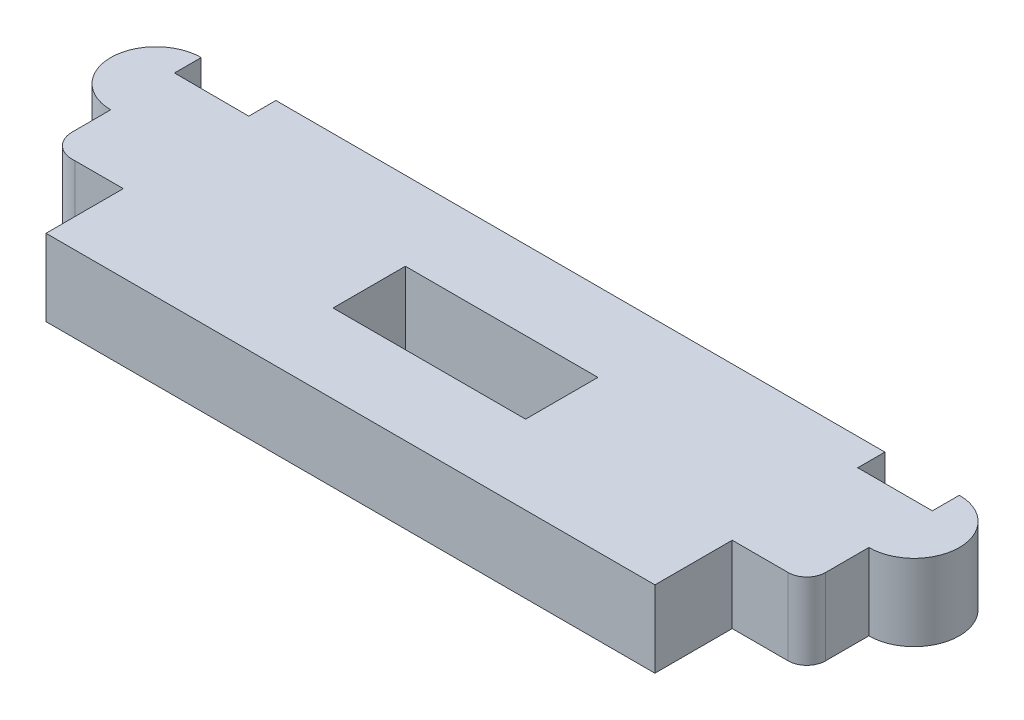
ISO-10303-21;
HEADER;
FILE_DESCRIPTION(('STEP AP214'),'2;1');
FILE_NAME('part.step','',(''),(''),'','','');
FILE_SCHEMA(('AUTOMOTIVE_DESIGN { 1 0 10303 214 1 1 1 1 }'));
ENDSEC;
DATA;
#1=APPLICATION_CONTEXT('core data for automotive mechanical design processes');
#2=APPLICATION_PROTOCOL_DEFINITION('international standard','automotive_design',2000,#1);
#3=PRODUCT_CONTEXT('',#1,'mechanical');
#4=PRODUCT('Part','Part','',(#3));
#5=PRODUCT_RELATED_PRODUCT_CATEGORY('part','',(#4));
#6=PRODUCT_DEFINITION_FORMATION('','',#4);
#7=PRODUCT_DEFINITION_CONTEXT('part definition',#1,'design');
#8=PRODUCT_DEFINITION('design','',#6,#7);
#9=PRODUCT_DEFINITION_SHAPE('','',#8);
#10=(LENGTH_UNIT() NAMED_UNIT(*) SI_UNIT(.MILLI.,.METRE.));
#11=(NAMED_UNIT(*) PLANE_ANGLE_UNIT() SI_UNIT($,.RADIAN.));
#12=(NAMED_UNIT(*) SI_UNIT($,.STERADIAN.) SOLID_ANGLE_UNIT());
#13=UNCERTAINTY_MEASURE_WITH_UNIT(LENGTH_MEASURE(1.E-05),#10,'distance_accuracy_value','');
#14=(GEOMETRIC_REPRESENTATION_CONTEXT(3) GLOBAL_UNCERTAINTY_ASSIGNED_CONTEXT((#13)) GLOBAL_UNIT_ASSIGNED_CONTEXT((#10,
#11,#12)) REPRESENTATION_CONTEXT('',''));
#15=CARTESIAN_POINT('',(0.,0.,0.));
#16=DIRECTION('',(0.,0.,1.));
#17=DIRECTION('',(1.,0.,0.));
#18=AXIS2_PLACEMENT_3D('',#15,#16,#17);
#19=CARTESIAN_POINT('',(-14.7404739766212,3.175,0.76986769505058));
#20=DIRECTION('',(0.,1.,0.));
#21=DIRECTION('',(0.,0.,1.));
#22=AXIS2_PLACEMENT_3D('',#19,#20,#21);
#23=PLANE('',#22);
#24=DIRECTION('',(1.,0.,0.));
#25=VECTOR('',#24,1.);
#26=CARTESIAN_POINT('',(14.9316149708302,3.175,1.7445249441059));
#27=LINE('',#26,#25);
#28=CARTESIAN_POINT('',(12.6259984908906,3.175,1.7445249441059));
#29=VERTEX_POINT('',#28);
#30=CARTESIAN_POINT('',(14.9316149708302,3.175,1.7445249441059));
#31=VERTEX_POINT('',#30);
#32=EDGE_CURVE('E218',#29,#31,#27,.T.);
#33=ORIENTED_EDGE('',*,*,#32,.T.);
#34=CARTESIAN_POINT('',(14.9485151949497,3.175,0.972713754794907));
#35=DIRECTION('',(0.,1.,0.));
#36=DIRECTION('',(0.,0.,-1.));
#37=AXIS2_PLACEMENT_3D('',#34,#35,#36);
#38=CIRCLE('',#37,0.771996197866893);
#39=CARTESIAN_POINT('',(15.7205113928165,3.175,0.972713754794907));
#40=VERTEX_POINT('',#39);
#41=EDGE_CURVE('E221',#31,#40,#38,.T.);
#42=ORIENTED_EDGE('',*,*,#41,.T.);
#43=DIRECTION('',(0.,0.,-1.));
#44=VECTOR('',#43,1.);
#45=CARTESIAN_POINT('',(15.7205113928165,3.175,-0.826531771009664));
#46=LINE('',#45,#44);
#47=CARTESIAN_POINT('',(15.7205113928165,3.175,-0.826531771009664));
#48=VERTEX_POINT('',#47);
#49=EDGE_CURVE('E224',#40,#48,#46,.T.);
#50=ORIENTED_EDGE('',*,*,#49,.T.);
#51=CARTESIAN_POINT('',(15.7205113928165,3.175,-2.70387840124867));
#52=DIRECTION('',(0.,1.,0.));
#53=DIRECTION('',(0.,0.,1.));
#54=AXIS2_PLACEMENT_3D('',#51,#52,#53);
#55=CIRCLE('',#54,1.877346630239);
#56=CARTESIAN_POINT('',(15.7205113928165,3.175,-4.58122503148767));
#57=VERTEX_POINT('',#56);
#58=EDGE_CURVE('E226',#48,#57,#55,.T.);
#59=ORIENTED_EDGE('',*,*,#58,.T.);
#60=DIRECTION('',(0.,0.,1.));
#61=VECTOR('',#60,1.);
#62=CARTESIAN_POINT('',(15.7205113928165,3.175,-3.46087411286336));
#63=LINE('',#62,#61);
#64=CARTESIAN_POINT('',(15.7205113928165,3.175,-3.46087411286336));
#65=VERTEX_POINT('',#64);
#66=EDGE_CURVE('E228',#57,#65,#63,.T.);
#67=ORIENTED_EDGE('',*,*,#66,.T.);
#68=DIRECTION('',(-1.,0.,0.));
#69=VECTOR('',#68,1.);
#70=CARTESIAN_POINT('',(12.6259984909252,3.175,-3.46087411286336));
#71=LINE('',#70,#69);
#72=CARTESIAN_POINT('',(12.6259984909252,3.175,-3.46087411286336));
#73=VERTEX_POINT('',#72);
#74=EDGE_CURVE('E230',#65,#73,#71,.T.);
#75=ORIENTED_EDGE('',*,*,#74,.T.);
#76=DIRECTION('',(0.,0.,-1.));
#77=VECTOR('',#76,1.);
#78=CARTESIAN_POINT('',(12.6259984909252,3.175,-4.58696761607907));
#79=LINE('',#78,#77);
#80=CARTESIAN_POINT('',(12.6259984909252,3.175,-4.58696761607907));
#81=VERTEX_POINT('',#80);
#82=EDGE_CURVE('E232',#73,#81,#79,.T.);
#83=ORIENTED_EDGE('',*,*,#82,.T.);
#84=DIRECTION('',(-1.,0.,0.));
#85=VECTOR('',#84,1.);
#86=CARTESIAN_POINT('',(-12.6312993131997,3.175,-4.58696761607907));
#87=LINE('',#86,#85);
#88=CARTESIAN_POINT('',(-12.6312993131997,3.175,-4.58696761607907));
#89=VERTEX_POINT('',#88);
#90=EDGE_CURVE('E234',#81,#89,#87,.T.);
#91=ORIENTED_EDGE('',*,*,#90,.T.);
#92=DIRECTION('',(0.,0.,1.));
#93=VECTOR('',#92,1.);
#94=CARTESIAN_POINT('',(-12.6312993131997,3.175,-3.46087411280918));
#95=LINE('',#94,#93);
#96=CARTESIAN_POINT('',(-12.6312993131997,3.175,-3.46087411280918));
#97=VERTEX_POINT('',#96);
#98=EDGE_CURVE('E236',#89,#97,#95,.T.);
#99=ORIENTED_EDGE('',*,*,#98,.T.);
#100=DIRECTION('',(-0.999993805106352,0.,-0.00351990751562791));
#101=VECTOR('',#100,1.);
#102=CARTESIAN_POINT('',(-15.7221735355993,3.175,-3.4717537716128));
#103=LINE('',#102,#101);
#104=CARTESIAN_POINT('',(-15.7221735355993,3.175,-3.4717537716128));
#105=VERTEX_POINT('',#104);
#106=EDGE_CURVE('E238',#97,#105,#103,.T.);
#107=ORIENTED_EDGE('',*,*,#106,.T.);
#108=DIRECTION('',(0.,0.,-1.));
#109=VECTOR('',#108,1.);
#110=CARTESIAN_POINT('',(-15.7221735355993,3.175,-4.5812250315731));
#111=LINE('',#110,#109);
#112=CARTESIAN_POINT('',(-15.7221735355993,3.175,-4.5812250315731));
#113=VERTEX_POINT('',#112);
#114=EDGE_CURVE('E240',#105,#113,#111,.T.);
#115=ORIENTED_EDGE('',*,*,#114,.T.);
#116=CARTESIAN_POINT('',(-15.7221735355993,3.175,-2.70403466214097));
#117=DIRECTION('',(0.,1.,0.));
#118=DIRECTION('',(0.,0.,1.));
#119=AXIS2_PLACEMENT_3D('',#116,#117,#118);
#120=CIRCLE('',#119,1.87719036943212);
#121=CARTESIAN_POINT('',(-15.7221735355993,3.175,-0.82684429270885));
#122=VERTEX_POINT('',#121);
#123=EDGE_CURVE('E242',#113,#122,#120,.T.);
#124=ORIENTED_EDGE('',*,*,#123,.T.);
#125=DIRECTION('',(0.,0.,1.));
#126=VECTOR('',#125,1.);
#127=CARTESIAN_POINT('',(-15.7221735355993,3.175,0.76986769505058));
#128=LINE('',#127,#126);
#129=CARTESIAN_POINT('',(-15.7221735355993,3.175,0.76986769505058));
#130=VERTEX_POINT('',#129);
#131=EDGE_CURVE('E244',#122,#130,#128,.T.);
#132=ORIENTED_EDGE('',*,*,#131,.T.);
#133=CARTESIAN_POINT('',(-14.7404739766212,3.175,0.76986769505058));
#134=DIRECTION('',(0.,1.,0.));
#135=DIRECTION('',(0.,0.,1.));
#136=AXIS2_PLACEMENT_3D('',#133,#134,#135);
#137=CIRCLE('',#136,0.981699558978084);
#138=CARTESIAN_POINT('',(-14.6230973564544,3.175,1.74452494410585));
#139=VERTEX_POINT('',#138);
#140=EDGE_CURVE('E246',#130,#139,#137,.T.);
#141=ORIENTED_EDGE('',*,*,#140,.T.);
#142=DIRECTION('',(1.,0.,0.));
#143=VECTOR('',#142,1.);
#144=CARTESIAN_POINT('',(-12.6291302410735,3.175,1.74452494410585));
#145=LINE('',#144,#143);
#146=CARTESIAN_POINT('',(-12.6291302410735,3.175,1.74452494410585));
#147=VERTEX_POINT('',#146);
#148=EDGE_CURVE('E248',#139,#147,#145,.T.);
#149=ORIENTED_EDGE('',*,*,#148,.T.);
#150=DIRECTION('',(0.,0.,1.));
#151=VECTOR('',#150,1.);
#152=CARTESIAN_POINT('',(-12.6291302410735,3.175,4.95039118635524));
#153=LINE('',#152,#151);
#154=CARTESIAN_POINT('',(-12.6291302410735,3.175,4.95039118635524));
#155=VERTEX_POINT('',#154);
#156=EDGE_CURVE('E250',#147,#155,#153,.T.);
#157=ORIENTED_EDGE('',*,*,#156,.T.);
#158=DIRECTION('',(1.,0.,0.));
#159=VECTOR('',#158,1.);
#160=CARTESIAN_POINT('',(12.6259984908906,3.175,4.95039118635524));
#161=LINE('',#160,#159);
#162=CARTESIAN_POINT('',(12.6259984908906,3.175,4.95039118635524));
#163=VERTEX_POINT('',#162);
#164=EDGE_CURVE('E252',#155,#163,#161,.T.);
#165=ORIENTED_EDGE('',*,*,#164,.T.);
#166=DIRECTION('',(0.,0.,-1.));
#167=VECTOR('',#166,1.);
#168=CARTESIAN_POINT('',(12.6259984908906,3.175,1.7445249441059));
#169=LINE('',#168,#167);
#170=EDGE_CURVE('E254',#163,#29,#169,.T.);
#171=ORIENTED_EDGE('',*,*,#170,.T.);
#172=EDGE_LOOP('',(#33,#42,#50,#59,#67,#75,#83,#91,#99,#107,#115,#124,#132,#141,#149,#157,#165,#171));
#173=FACE_BOUND('',#172,.T.);
#174=DIRECTION('',(0.,0.,1.));
#175=VECTOR('',#174,1.);
#176=CARTESIAN_POINT('',(-3.99291334830593,3.175,1.68174716550343));
#177=LINE('',#176,#175);
#178=CARTESIAN_POINT('',(-3.99291334830593,3.175,-1.31834312696205));
#179=VERTEX_POINT('',#178);
#180=CARTESIAN_POINT('',(-3.99291334830593,3.175,1.68174716550343));
#181=VERTEX_POINT('',#180);
#182=EDGE_CURVE('E190',#179,#181,#177,.T.);
#183=ORIENTED_EDGE('',*,*,#182,.F.);
#184=DIRECTION('',(-1.,0.,0.));
#185=VECTOR('',#184,1.);
#186=CARTESIAN_POINT('',(-3.99291334830593,3.175,-1.31834312696205));
#187=LINE('',#186,#185);
#188=CARTESIAN_POINT('',(3.99291822223341,3.175,-1.31834312696205));
#189=VERTEX_POINT('',#188);
#190=EDGE_CURVE('E182',#189,#179,#187,.T.);
#191=ORIENTED_EDGE('',*,*,#190,.F.);
#192=DIRECTION('',(0.,0.,-1.));
#193=VECTOR('',#192,1.);
#194=CARTESIAN_POINT('',(3.99291822223341,3.175,-1.31834312696205));
#195=LINE('',#194,#193);
#196=CARTESIAN_POINT('',(3.99291822223341,3.175,1.68174716550343));
#197=VERTEX_POINT('',#196);
#198=EDGE_CURVE('E204',#197,#189,#195,.T.);
#199=ORIENTED_EDGE('',*,*,#198,.F.);
#200=DIRECTION('',(1.,0.,0.));
#201=VECTOR('',#200,1.);
#202=CARTESIAN_POINT('',(3.99291822223341,3.175,1.68174716550343));
#203=LINE('',#202,#201);
#204=EDGE_CURVE('E202',#181,#197,#203,.T.);
#205=ORIENTED_EDGE('',*,*,#204,.F.);
#206=EDGE_LOOP('',(#183,#191,#199,#205));
#207=FACE_BOUND('',#206,.T.);
#208=ADVANCED_FACE('F33',(#173,#207),#23,.T.);
#209=CARTESIAN_POINT('',(-14.7404739766212,0.,0.76986769505058));
#210=DIRECTION('',(0.,1.,0.));
#211=DIRECTION('',(0.,0.,1.));
#212=AXIS2_PLACEMENT_3D('',#209,#210,#211);
#213=PLANE('',#212);
#214=DIRECTION('',(1.,0.,0.));
#215=VECTOR('',#214,1.);
#216=CARTESIAN_POINT('',(14.9316149708302,0.,1.7445249441059));
#217=LINE('',#216,#215);
#218=CARTESIAN_POINT('',(12.6259984908906,0.,1.7445249441059));
#219=VERTEX_POINT('',#218);
#220=CARTESIAN_POINT('',(14.9316149708302,0.,1.7445249441059));
#221=VERTEX_POINT('',#220);
#222=EDGE_CURVE('E198',#219,#221,#217,.T.);
#223=ORIENTED_EDGE('',*,*,#222,.F.);
#224=DIRECTION('',(0.,0.,-1.));
#225=VECTOR('',#224,1.);
#226=CARTESIAN_POINT('',(12.6259984908906,0.,1.7445249441059));
#227=LINE('',#226,#225);
#228=CARTESIAN_POINT('',(12.6259984908906,0.,4.95039118635524));
#229=VERTEX_POINT('',#228);
#230=EDGE_CURVE('E222',#229,#219,#227,.T.);
#231=ORIENTED_EDGE('',*,*,#230,.F.);
#232=DIRECTION('',(1.,0.,0.));
#233=VECTOR('',#232,1.);
#234=CARTESIAN_POINT('',(12.6259984908906,0.,4.95039118635524));
#235=LINE('',#234,#233);
#236=CARTESIAN_POINT('',(-12.6291302410735,0.,4.95039118635524));
#237=VERTEX_POINT('',#236);
#238=EDGE_CURVE('E289',#237,#229,#235,.T.);
#239=ORIENTED_EDGE('',*,*,#238,.F.);
#240=DIRECTION('',(0.,0.,1.));
#241=VECTOR('',#240,1.);
#242=CARTESIAN_POINT('',(-12.6291302410735,0.,4.95039118635524));
#243=LINE('',#242,#241);
#244=CARTESIAN_POINT('',(-12.6291302410735,0.,1.74452494410585));
#245=VERTEX_POINT('',#244);
#246=EDGE_CURVE('E287',#245,#237,#243,.T.);
#247=ORIENTED_EDGE('',*,*,#246,.F.);
#248=DIRECTION('',(1.,0.,0.));
#249=VECTOR('',#248,1.);
#250=CARTESIAN_POINT('',(-12.6291302410735,0.,1.74452494410585));
#251=LINE('',#250,#249);
#252=CARTESIAN_POINT('',(-14.6230973564544,0.,1.74452494410585));
#253=VERTEX_POINT('',#252);
#254=EDGE_CURVE('E285',#253,#245,#251,.T.);
#255=ORIENTED_EDGE('',*,*,#254,.F.);
#256=CARTESIAN_POINT('',(-14.7404739766212,0.,0.76986769505058));
#257=DIRECTION('',(0.,1.,0.));
#258=DIRECTION('',(0.,0.,1.));
#259=AXIS2_PLACEMENT_3D('',#256,#257,#258);
#260=CIRCLE('',#259,0.981699558978084);
#261=CARTESIAN_POINT('',(-15.7221735355993,0.,0.76986769505058));
#262=VERTEX_POINT('',#261);
#263=EDGE_CURVE('E283',#262,#253,#260,.T.);
#264=ORIENTED_EDGE('',*,*,#263,.F.);
#265=DIRECTION('',(0.,0.,1.));
#266=VECTOR('',#265,1.);
#267=CARTESIAN_POINT('',(-15.7221735355993,0.,0.76986769505058));
#268=LINE('',#267,#266);
#269=CARTESIAN_POINT('',(-15.7221735355993,0.,-0.82684429270885));
#270=VERTEX_POINT('',#269);
#271=EDGE_CURVE('E281',#270,#262,#268,.T.);
#272=ORIENTED_EDGE('',*,*,#271,.F.);
#273=CARTESIAN_POINT('',(-15.7221735355993,0.,-2.70403466214097));
#274=DIRECTION('',(0.,1.,0.));
#275=DIRECTION('',(0.,0.,1.));
#276=AXIS2_PLACEMENT_3D('',#273,#274,#275);
#277=CIRCLE('',#276,1.87719036943212);
#278=CARTESIAN_POINT('',(-15.7221735355993,0.,-4.5812250315731));
#279=VERTEX_POINT('',#278);
#280=EDGE_CURVE('E279',#279,#270,#277,.T.);
#281=ORIENTED_EDGE('',*,*,#280,.F.);
#282=DIRECTION('',(0.,0.,-1.));
#283=VECTOR('',#282,1.);
#284=CARTESIAN_POINT('',(-15.7221735355993,0.,-4.5812250315731));
#285=LINE('',#284,#283);
#286=CARTESIAN_POINT('',(-15.7221735355993,0.,-3.4717537716128));
#287=VERTEX_POINT('',#286);
#288=EDGE_CURVE('E277',#287,#279,#285,.T.);
#289=ORIENTED_EDGE('',*,*,#288,.F.);
#290=DIRECTION('',(-0.999993805106352,0.,-0.00351990751562791));
#291=VECTOR('',#290,1.);
#292=CARTESIAN_POINT('',(-15.7221735355993,0.,-3.4717537716128));
#293=LINE('',#292,#291);
#294=CARTESIAN_POINT('',(-12.6312993131997,0.,-3.46087411280918));
#295=VERTEX_POINT('',#294);
#296=EDGE_CURVE('E275',#295,#287,#293,.T.);
#297=ORIENTED_EDGE('',*,*,#296,.F.);
#298=DIRECTION('',(0.,0.,1.));
#299=VECTOR('',#298,1.);
#300=CARTESIAN_POINT('',(-12.6312993131997,0.,-3.46087411280918));
#301=LINE('',#300,#299);
#302=CARTESIAN_POINT('',(-12.6312993131997,0.,-4.58696761607907));
#303=VERTEX_POINT('',#302);
#304=EDGE_CURVE('E273',#303,#295,#301,.T.);
#305=ORIENTED_EDGE('',*,*,#304,.F.);
#306=DIRECTION('',(-1.,0.,0.));
#307=VECTOR('',#306,1.);
#308=CARTESIAN_POINT('',(-12.6312993131997,0.,-4.58696761607907));
#309=LINE('',#308,#307);
#310=CARTESIAN_POINT('',(12.6259984909252,0.,-4.58696761607907));
#311=VERTEX_POINT('',#310);
#312=EDGE_CURVE('E271',#311,#303,#309,.T.);
#313=ORIENTED_EDGE('',*,*,#312,.F.);
#314=DIRECTION('',(0.,0.,-1.));
#315=VECTOR('',#314,1.);
#316=CARTESIAN_POINT('',(12.6259984909252,0.,-4.58696761607907));
#317=LINE('',#316,#315);
#318=CARTESIAN_POINT('',(12.6259984909252,0.,-3.46087411286336));
#319=VERTEX_POINT('',#318);
#320=EDGE_CURVE('E269',#319,#311,#317,.T.);
#321=ORIENTED_EDGE('',*,*,#320,.F.);
#322=DIRECTION('',(-1.,0.,0.));
#323=VECTOR('',#322,1.);
#324=CARTESIAN_POINT('',(12.6259984909252,0.,-3.46087411286336));
#325=LINE('',#324,#323);
#326=CARTESIAN_POINT('',(15.7205113928165,0.,-3.46087411286336));
#327=VERTEX_POINT('',#326);
#328=EDGE_CURVE('E267',#327,#319,#325,.T.);
#329=ORIENTED_EDGE('',*,*,#328,.F.);
#330=DIRECTION('',(0.,0.,1.));
#331=VECTOR('',#330,1.);
#332=CARTESIAN_POINT('',(15.7205113928165,0.,-3.46087411286336));
#333=LINE('',#332,#331);
#334=CARTESIAN_POINT('',(15.7205113928165,0.,-4.58122503148767));
#335=VERTEX_POINT('',#334);
#336=EDGE_CURVE('E265',#335,#327,#333,.T.);
#337=ORIENTED_EDGE('',*,*,#336,.F.);
#338=CARTESIAN_POINT('',(15.7205113928165,0.,-2.70387840124867));
#339=DIRECTION('',(0.,1.,0.));
#340=DIRECTION('',(0.,0.,1.));
#341=AXIS2_PLACEMENT_3D('',#338,#339,#340);
#342=CIRCLE('',#341,1.877346630239);
#343=CARTESIAN_POINT('',(15.7205113928165,0.,-0.826531771009664));
#344=VERTEX_POINT('',#343);
#345=EDGE_CURVE('E263',#344,#335,#342,.T.);
#346=ORIENTED_EDGE('',*,*,#345,.F.);
#347=DIRECTION('',(0.,0.,-1.));
#348=VECTOR('',#347,1.);
#349=CARTESIAN_POINT('',(15.7205113928165,0.,-0.826531771009664));
#350=LINE('',#349,#348);
#351=CARTESIAN_POINT('',(15.7205113928165,0.,0.972713754794907));
#352=VERTEX_POINT('',#351);
#353=EDGE_CURVE('E261',#352,#344,#350,.T.);
#354=ORIENTED_EDGE('',*,*,#353,.F.);
#355=CARTESIAN_POINT('',(14.9485151949497,0.,0.972713754794907));
#356=DIRECTION('',(0.,1.,0.));
#357=DIRECTION('',(0.,0.,-1.));
#358=AXIS2_PLACEMENT_3D('',#355,#356,#357);
#359=CIRCLE('',#358,0.771996197866893);
#360=EDGE_CURVE('E259',#221,#352,#359,.T.);
#361=ORIENTED_EDGE('',*,*,#360,.F.);
#362=EDGE_LOOP('',(#223,#231,#239,#247,#255,#264,#272,#281,#289,#297,#305,#313,#321,#329,#337,
#346,#354,#361));
#363=FACE_BOUND('',#362,.T.);
#364=DIRECTION('',(-1.,0.,0.));
#365=VECTOR('',#364,1.);
#366=CARTESIAN_POINT('',(-3.99291334830593,0.,-1.31834312696205));
#367=LINE('',#366,#365);
#368=CARTESIAN_POINT('',(3.99291822223341,0.,-1.31834312696205));
#369=VERTEX_POINT('',#368);
#370=CARTESIAN_POINT('',(-3.99291334830593,0.,-1.31834312696205));
#371=VERTEX_POINT('',#370);
#372=EDGE_CURVE('E56',#369,#371,#367,.T.);
#373=ORIENTED_EDGE('',*,*,#372,.T.);
#374=DIRECTION('',(0.,0.,1.));
#375=VECTOR('',#374,1.);
#376=CARTESIAN_POINT('',(-3.99291334830593,0.,1.68174716550343));
#377=LINE('',#376,#375);
#378=CARTESIAN_POINT('',(-3.99291334830593,0.,1.68174716550343));
#379=VERTEX_POINT('',#378);
#380=EDGE_CURVE('E197',#371,#379,#377,.T.);
#381=ORIENTED_EDGE('',*,*,#380,.T.);
#382=DIRECTION('',(1.,0.,0.));
#383=VECTOR('',#382,1.);
#384=CARTESIAN_POINT('',(3.99291822223341,0.,1.68174716550343));
#385=LINE('',#384,#383);
#386=CARTESIAN_POINT('',(3.99291822223341,0.,1.68174716550343));
#387=VERTEX_POINT('',#386);
#388=EDGE_CURVE('E210',#379,#387,#385,.T.);
#389=ORIENTED_EDGE('',*,*,#388,.T.);
#390=DIRECTION('',(0.,0.,-1.));
#391=VECTOR('',#390,1.);
#392=CARTESIAN_POINT('',(3.99291822223341,0.,-1.31834312696205));
#393=LINE('',#392,#391);
#394=EDGE_CURVE('E191',#387,#369,#393,.T.);
#395=ORIENTED_EDGE('',*,*,#394,.T.);
#396=EDGE_LOOP('',(#373,#381,#389,#395));
#397=FACE_BOUND('',#396,.T.);
#398=ADVANCED_FACE('F349',(#363,#397),#213,.F.);
#399=CARTESIAN_POINT('',(14.9316149708302,3.175,1.7445249441059));
#400=DIRECTION('',(0.,0.,-1.));
#401=DIRECTION('',(-1.,0.,0.));
#402=AXIS2_PLACEMENT_3D('',#399,#400,#401);
#403=PLANE('',#402);
#404=ORIENTED_EDGE('',*,*,#222,.T.);
#405=DIRECTION('',(0.,-1.,0.));
#406=VECTOR('',#405,1.);
#407=CARTESIAN_POINT('',(14.9316149708302,3.175,1.7445249441059));
#408=LINE('',#407,#406);
#409=EDGE_CURVE('E11',#31,#221,#408,.T.);
#410=ORIENTED_EDGE('',*,*,#409,.F.);
#411=ORIENTED_EDGE('',*,*,#32,.F.);
#412=DIRECTION('',(0.,-1.,0.));
#413=VECTOR('',#412,1.);
#414=CARTESIAN_POINT('',(12.6259984908906,3.175,1.7445249441059));
#415=LINE('',#414,#413);
#416=EDGE_CURVE('E256',#29,#219,#415,.T.);
#417=ORIENTED_EDGE('',*,*,#416,.T.);
#418=EDGE_LOOP('',(#404,#410,#411,#417));
#419=FACE_BOUND('',#418,.T.);
#420=ADVANCED_FACE('F35',(#419),#403,.F.);
#421=CARTESIAN_POINT('',(14.9485151949497,3.175,0.972713754794907));
#422=DIRECTION('',(0.,-1.,0.));
#423=DIRECTION('',(0.,0.,-1.));
#424=AXIS2_PLACEMENT_3D('',#421,#422,#423);
#425=CYLINDRICAL_SURFACE('',#424,0.771996197866893);
#426=ORIENTED_EDGE('',*,*,#360,.T.);
#427=DIRECTION('',(0.,-1.,0.));
#428=VECTOR('',#427,1.);
#429=CARTESIAN_POINT('',(15.7205113928165,3.175,0.972713754794907));
#430=LINE('',#429,#428);
#431=EDGE_CURVE('E41',#40,#352,#430,.T.);
#432=ORIENTED_EDGE('',*,*,#431,.F.);
#433=ORIENTED_EDGE('',*,*,#41,.F.);
#434=ORIENTED_EDGE('',*,*,#409,.T.);
#435=EDGE_LOOP('',(#426,#432,#433,#434));
#436=FACE_BOUND('',#435,.T.);
#437=ADVANCED_FACE('F366',(#436),#425,.T.);
#438=CARTESIAN_POINT('',(15.7205113928165,3.175,-0.826531771009664));
#439=DIRECTION('',(-1.,0.,0.));
#440=DIRECTION('',(0.,0.,1.));
#441=AXIS2_PLACEMENT_3D('',#438,#439,#440);
#442=PLANE('',#441);
#443=ORIENTED_EDGE('',*,*,#353,.T.);
#444=DIRECTION('',(0.,-1.,0.));
#445=VECTOR('',#444,1.);
#446=CARTESIAN_POINT('',(15.7205113928165,3.175,-0.826531771009664));
#447=LINE('',#446,#445);
#448=EDGE_CURVE('E336',#48,#344,#447,.T.);
#449=ORIENTED_EDGE('',*,*,#448,.F.);
#450=ORIENTED_EDGE('',*,*,#49,.F.);
#451=ORIENTED_EDGE('',*,*,#431,.T.);
#452=EDGE_LOOP('',(#443,#449,#450,#451));
#453=FACE_BOUND('',#452,.T.);
#454=ADVANCED_FACE('F343',(#453),#442,.F.);
#455=CARTESIAN_POINT('',(15.7205113928165,3.175,-2.70387840124867));
#456=DIRECTION('',(0.,-1.,0.));
#457=DIRECTION('',(0.,0.,-1.));
#458=AXIS2_PLACEMENT_3D('',#455,#456,#457);
#459=CYLINDRICAL_SURFACE('',#458,1.877346630239);
#460=ORIENTED_EDGE('',*,*,#345,.T.);
#461=DIRECTION('',(0.,-1.,0.));
#462=VECTOR('',#461,1.);
#463=CARTESIAN_POINT('',(15.7205113928165,3.175,-4.58122503148767));
#464=LINE('',#463,#462);
#465=EDGE_CURVE('E333',#57,#335,#464,.T.);
#466=ORIENTED_EDGE('',*,*,#465,.F.);
#467=ORIENTED_EDGE('',*,*,#58,.F.);
#468=ORIENTED_EDGE('',*,*,#448,.T.);
#469=EDGE_LOOP('',(#460,#466,#467,#468));
#470=FACE_BOUND('',#469,.T.);
#471=ADVANCED_FACE('F355',(#470),#459,.T.);
#472=CARTESIAN_POINT('',(15.7205113928165,3.175,-3.46087411286336));
#473=DIRECTION('',(1.,0.,0.));
#474=DIRECTION('',(0.,0.,-1.));
#475=AXIS2_PLACEMENT_3D('',#472,#473,#474);
#476=PLANE('',#475);
#477=ORIENTED_EDGE('',*,*,#336,.T.);
#478=DIRECTION('',(0.,-1.,0.));
#479=VECTOR('',#478,1.);
#480=CARTESIAN_POINT('',(15.7205113928165,3.175,-3.46087411286336));
#481=LINE('',#480,#479);
#482=EDGE_CURVE('E330',#65,#327,#481,.T.);
#483=ORIENTED_EDGE('',*,*,#482,.F.);
#484=ORIENTED_EDGE('',*,*,#66,.F.);
#485=ORIENTED_EDGE('',*,*,#465,.T.);
#486=EDGE_LOOP('',(#477,#483,#484,#485));
#487=FACE_BOUND('',#486,.T.);
#488=ADVANCED_FACE('F359',(#487),#476,.F.);
#489=CARTESIAN_POINT('',(12.6259984909252,3.175,-3.46087411286336));
#490=DIRECTION('',(0.,0.,1.));
#491=DIRECTION('',(1.,0.,0.));
#492=AXIS2_PLACEMENT_3D('',#489,#490,#491);
#493=PLANE('',#492);
#494=ORIENTED_EDGE('',*,*,#328,.T.);
#495=DIRECTION('',(0.,-1.,0.));
#496=VECTOR('',#495,1.);
#497=CARTESIAN_POINT('',(12.6259984909252,3.175,-3.46087411286336));
#498=LINE('',#497,#496);
#499=EDGE_CURVE('E327',#73,#319,#498,.T.);
#500=ORIENTED_EDGE('',*,*,#499,.F.);
#501=ORIENTED_EDGE('',*,*,#74,.F.);
#502=ORIENTED_EDGE('',*,*,#482,.T.);
#503=EDGE_LOOP('',(#494,#500,#501,#502));
#504=FACE_BOUND('',#503,.T.);
#505=ADVANCED_FACE('F429',(#504),#493,.F.);
#506=CARTESIAN_POINT('',(12.6259984909252,3.175,-4.58696761607907));
#507=DIRECTION('',(-1.,0.,0.));
#508=DIRECTION('',(0.,0.,1.));
#509=AXIS2_PLACEMENT_3D('',#506,#507,#508);
#510=PLANE('',#509);
#511=ORIENTED_EDGE('',*,*,#320,.T.);
#512=DIRECTION('',(0.,-1.,0.));
#513=VECTOR('',#512,1.);
#514=CARTESIAN_POINT('',(12.6259984909252,3.175,-4.58696761607907));
#515=LINE('',#514,#513);
#516=EDGE_CURVE('E324',#81,#311,#515,.T.);
#517=ORIENTED_EDGE('',*,*,#516,.F.);
#518=ORIENTED_EDGE('',*,*,#82,.F.);
#519=ORIENTED_EDGE('',*,*,#499,.T.);
#520=EDGE_LOOP('',(#511,#517,#518,#519));
#521=FACE_BOUND('',#520,.T.);
#522=ADVANCED_FACE('F427',(#521),#510,.F.);
#523=CARTESIAN_POINT('',(-12.6312993131997,3.175,-4.58696761607907));
#524=DIRECTION('',(0.,0.,1.));
#525=DIRECTION('',(1.,0.,0.));
#526=AXIS2_PLACEMENT_3D('',#523,#524,#525);
#527=PLANE('',#526);
#528=ORIENTED_EDGE('',*,*,#312,.T.);
#529=DIRECTION('',(0.,-1.,0.));
#530=VECTOR('',#529,1.);
#531=CARTESIAN_POINT('',(-12.6312993131997,3.175,-4.58696761607907));
#532=LINE('',#531,#530);
#533=EDGE_CURVE('E321',#89,#303,#532,.T.);
#534=ORIENTED_EDGE('',*,*,#533,.F.);
#535=ORIENTED_EDGE('',*,*,#90,.F.);
#536=ORIENTED_EDGE('',*,*,#516,.T.);
#537=EDGE_LOOP('',(#528,#534,#535,#536));
#538=FACE_BOUND('',#537,.T.);
#539=ADVANCED_FACE('F423',(#538),#527,.F.);
#540=CARTESIAN_POINT('',(-12.6312993131997,3.175,-3.46087411280918));
#541=DIRECTION('',(1.,0.,0.));
#542=DIRECTION('',(0.,0.,-1.));
#543=AXIS2_PLACEMENT_3D('',#540,#541,#542);
#544=PLANE('',#543);
#545=ORIENTED_EDGE('',*,*,#304,.T.);
#546=DIRECTION('',(0.,-1.,0.));
#547=VECTOR('',#546,1.);
#548=CARTESIAN_POINT('',(-12.6312993131997,3.175,-3.46087411280918));
#549=LINE('',#548,#547);
#550=EDGE_CURVE('E318',#97,#295,#549,.T.);
#551=ORIENTED_EDGE('',*,*,#550,.F.);
#552=ORIENTED_EDGE('',*,*,#98,.F.);
#553=ORIENTED_EDGE('',*,*,#533,.T.);
#554=EDGE_LOOP('',(#545,#551,#552,#553));
#555=FACE_BOUND('',#554,.T.);
#556=ADVANCED_FACE('F418',(#555),#544,.F.);
#557=CARTESIAN_POINT('',(-15.7221735355993,3.175,-3.4717537716128));
#558=DIRECTION('',(-0.00351990751562791,0.,0.999993805106352));
#559=DIRECTION('',(0.999993805106352,0.,0.00351990751562791));
#560=AXIS2_PLACEMENT_3D('',#557,#558,#559);
#561=PLANE('',#560);
#562=ORIENTED_EDGE('',*,*,#296,.T.);
#563=DIRECTION('',(0.,-1.,0.));
#564=VECTOR('',#563,1.);
#565=CARTESIAN_POINT('',(-15.7221735355993,3.175,-3.4717537716128));
#566=LINE('',#565,#564);
#567=EDGE_CURVE('E315',#105,#287,#566,.T.);
#568=ORIENTED_EDGE('',*,*,#567,.F.);
#569=ORIENTED_EDGE('',*,*,#106,.F.);
#570=ORIENTED_EDGE('',*,*,#550,.T.);
#571=EDGE_LOOP('',(#562,#568,#569,#570));
#572=FACE_BOUND('',#571,.T.);
#573=ADVANCED_FACE('F412',(#572),#561,.F.);
#574=CARTESIAN_POINT('',(-15.7221735355993,3.175,-4.5812250315731));
#575=DIRECTION('',(-1.,0.,0.));
#576=DIRECTION('',(0.,0.,1.));
#577=AXIS2_PLACEMENT_3D('',#574,#575,#576);
#578=PLANE('',#577);
#579=ORIENTED_EDGE('',*,*,#288,.T.);
#580=DIRECTION('',(0.,-1.,0.));
#581=VECTOR('',#580,1.);
#582=CARTESIAN_POINT('',(-15.7221735355993,3.175,-4.5812250315731));
#583=LINE('',#582,#581);
#584=EDGE_CURVE('E312',#113,#279,#583,.T.);
#585=ORIENTED_EDGE('',*,*,#584,.F.);
#586=ORIENTED_EDGE('',*,*,#114,.F.);
#587=ORIENTED_EDGE('',*,*,#567,.T.);
#588=EDGE_LOOP('',(#579,#585,#586,#587));
#589=FACE_BOUND('',#588,.T.);
#590=ADVANCED_FACE('F408',(#589),#578,.F.);
#591=CARTESIAN_POINT('',(-15.7221735355993,3.175,-2.70403466214097));
#592=DIRECTION('',(0.,-1.,0.));
#593=DIRECTION('',(0.,0.,-1.));
#594=AXIS2_PLACEMENT_3D('',#591,#592,#593);
#595=CYLINDRICAL_SURFACE('',#594,1.87719036943212);
#596=ORIENTED_EDGE('',*,*,#280,.T.);
#597=DIRECTION('',(0.,-1.,0.));
#598=VECTOR('',#597,1.);
#599=CARTESIAN_POINT('',(-15.7221735355993,3.175,-0.82684429270885));
#600=LINE('',#599,#598);
#601=EDGE_CURVE('E309',#122,#270,#600,.T.);
#602=ORIENTED_EDGE('',*,*,#601,.F.);
#603=ORIENTED_EDGE('',*,*,#123,.F.);
#604=ORIENTED_EDGE('',*,*,#584,.T.);
#605=EDGE_LOOP('',(#596,#602,#603,#604));
#606=FACE_BOUND('',#605,.T.);
#607=ADVANCED_FACE('F403',(#606),#595,.T.);
#608=CARTESIAN_POINT('',(-15.7221735355993,3.175,0.76986769505058));
#609=DIRECTION('',(1.,0.,0.));
#610=DIRECTION('',(0.,0.,-1.));
#611=AXIS2_PLACEMENT_3D('',#608,#609,#610);
#612=PLANE('',#611);
#613=ORIENTED_EDGE('',*,*,#271,.T.);
#614=DIRECTION('',(0.,-1.,0.));
#615=VECTOR('',#614,1.);
#616=CARTESIAN_POINT('',(-15.7221735355993,3.175,0.76986769505058));
#617=LINE('',#616,#615);
#618=EDGE_CURVE('E306',#130,#262,#617,.T.);
#619=ORIENTED_EDGE('',*,*,#618,.F.);
#620=ORIENTED_EDGE('',*,*,#131,.F.);
#621=ORIENTED_EDGE('',*,*,#601,.T.);
#622=EDGE_LOOP('',(#613,#619,#620,#621));
#623=FACE_BOUND('',#622,.T.);
#624=ADVANCED_FACE('F397',(#623),#612,.F.);
#625=CARTESIAN_POINT('',(-14.7404739766212,3.175,0.76986769505058));
#626=DIRECTION('',(0.,-1.,0.));
#627=DIRECTION('',(0.,0.,-1.));
#628=AXIS2_PLACEMENT_3D('',#625,#626,#627);
#629=CYLINDRICAL_SURFACE('',#628,0.981699558978084);
#630=ORIENTED_EDGE('',*,*,#263,.T.);
#631=DIRECTION('',(0.,-1.,0.));
#632=VECTOR('',#631,1.);
#633=CARTESIAN_POINT('',(-14.6230973564544,3.175,1.74452494410585));
#634=LINE('',#633,#632);
#635=EDGE_CURVE('E303',#139,#253,#634,.T.);
#636=ORIENTED_EDGE('',*,*,#635,.F.);
#637=ORIENTED_EDGE('',*,*,#140,.F.);
#638=ORIENTED_EDGE('',*,*,#618,.T.);
#639=EDGE_LOOP('',(#630,#636,#637,#638));
#640=FACE_BOUND('',#639,.T.);
#641=ADVANCED_FACE('F393',(#640),#629,.T.);
#642=CARTESIAN_POINT('',(-12.6291302410735,3.175,1.74452494410585));
#643=DIRECTION('',(0.,0.,-1.));
#644=DIRECTION('',(-1.,0.,0.));
#645=AXIS2_PLACEMENT_3D('',#642,#643,#644);
#646=PLANE('',#645);
#647=ORIENTED_EDGE('',*,*,#254,.T.);
#648=DIRECTION('',(0.,-1.,0.));
#649=VECTOR('',#648,1.);
#650=CARTESIAN_POINT('',(-12.6291302410735,3.175,1.74452494410585));
#651=LINE('',#650,#649);
#652=EDGE_CURVE('E300',#147,#245,#651,.T.);
#653=ORIENTED_EDGE('',*,*,#652,.F.);
#654=ORIENTED_EDGE('',*,*,#148,.F.);
#655=ORIENTED_EDGE('',*,*,#635,.T.);
#656=EDGE_LOOP('',(#647,#653,#654,#655));
#657=FACE_BOUND('',#656,.T.);
#658=ADVANCED_FACE('F388',(#657),#646,.F.);
#659=CARTESIAN_POINT('',(-12.6291302410735,3.175,4.95039118635524));
#660=DIRECTION('',(1.,0.,0.));
#661=DIRECTION('',(0.,0.,-1.));
#662=AXIS2_PLACEMENT_3D('',#659,#660,#661);
#663=PLANE('',#662);
#664=ORIENTED_EDGE('',*,*,#246,.T.);
#665=DIRECTION('',(0.,-1.,0.));
#666=VECTOR('',#665,1.);
#667=CARTESIAN_POINT('',(-12.6291302410735,3.175,4.95039118635524));
#668=LINE('',#667,#666);
#669=EDGE_CURVE('E297',#155,#237,#668,.T.);
#670=ORIENTED_EDGE('',*,*,#669,.F.);
#671=ORIENTED_EDGE('',*,*,#156,.F.);
#672=ORIENTED_EDGE('',*,*,#652,.T.);
#673=EDGE_LOOP('',(#664,#670,#671,#672));
#674=FACE_BOUND('',#673,.T.);
#675=ADVANCED_FACE('F382',(#674),#663,.F.);
#676=CARTESIAN_POINT('',(12.6259984908906,3.175,4.95039118635524));
#677=DIRECTION('',(0.,0.,-1.));
#678=DIRECTION('',(-1.,0.,0.));
#679=AXIS2_PLACEMENT_3D('',#676,#677,#678);
#680=PLANE('',#679);
#681=ORIENTED_EDGE('',*,*,#238,.T.);
#682=DIRECTION('',(0.,-1.,0.));
#683=VECTOR('',#682,1.);
#684=CARTESIAN_POINT('',(12.6259984908906,3.175,4.95039118635524));
#685=LINE('',#684,#683);
#686=EDGE_CURVE('E294',#163,#229,#685,.T.);
#687=ORIENTED_EDGE('',*,*,#686,.F.);
#688=ORIENTED_EDGE('',*,*,#164,.F.);
#689=ORIENTED_EDGE('',*,*,#669,.T.);
#690=EDGE_LOOP('',(#681,#687,#688,#689));
#691=FACE_BOUND('',#690,.T.);
#692=ADVANCED_FACE('F378',(#691),#680,.F.);
#693=CARTESIAN_POINT('',(12.6259984908906,3.175,1.7445249441059));
#694=DIRECTION('',(-1.,0.,0.));
#695=DIRECTION('',(0.,0.,1.));
#696=AXIS2_PLACEMENT_3D('',#693,#694,#695);
#697=PLANE('',#696);
#698=ORIENTED_EDGE('',*,*,#230,.T.);
#699=ORIENTED_EDGE('',*,*,#416,.F.);
#700=ORIENTED_EDGE('',*,*,#170,.F.);
#701=ORIENTED_EDGE('',*,*,#686,.T.);
#702=EDGE_LOOP('',(#698,#699,#700,#701));
#703=FACE_BOUND('',#702,.T.);
#704=ADVANCED_FACE('F373',(#703),#697,.F.);
#705=CARTESIAN_POINT('',(-3.99291334830593,3.175,-1.31834312696205));
#706=DIRECTION('',(0.,0.,1.));
#707=DIRECTION('',(1.,0.,0.));
#708=AXIS2_PLACEMENT_3D('',#705,#706,#707);
#709=PLANE('',#708);
#710=ORIENTED_EDGE('',*,*,#372,.F.);
#711=DIRECTION('',(0.,-1.,0.));
#712=VECTOR('',#711,1.);
#713=CARTESIAN_POINT('',(3.99291822223341,3.175,-1.31834312696205));
#714=LINE('',#713,#712);
#715=EDGE_CURVE('E186',#189,#369,#714,.T.);
#716=ORIENTED_EDGE('',*,*,#715,.F.);
#717=ORIENTED_EDGE('',*,*,#190,.T.);
#718=DIRECTION('',(0.,-1.,0.));
#719=VECTOR('',#718,1.);
#720=CARTESIAN_POINT('',(-3.99291334830593,3.175,-1.31834312696205));
#721=LINE('',#720,#719);
#722=EDGE_CURVE('E185',#179,#371,#721,.T.);
#723=ORIENTED_EDGE('',*,*,#722,.T.);
#724=EDGE_LOOP('',(#710,#716,#717,#723));
#725=FACE_BOUND('',#724,.T.);
#726=ADVANCED_FACE('F184',(#725),#709,.T.);
#727=CARTESIAN_POINT('',(-3.99291334830593,3.175,1.68174716550343));
#728=DIRECTION('',(1.,0.,0.));
#729=DIRECTION('',(0.,0.,-1.));
#730=AXIS2_PLACEMENT_3D('',#727,#728,#729);
#731=PLANE('',#730);
#732=ORIENTED_EDGE('',*,*,#380,.F.);
#733=ORIENTED_EDGE('',*,*,#722,.F.);
#734=ORIENTED_EDGE('',*,*,#182,.T.);
#735=DIRECTION('',(0.,-1.,0.));
#736=VECTOR('',#735,1.);
#737=CARTESIAN_POINT('',(-3.99291334830593,3.175,1.68174716550343));
#738=LINE('',#737,#736);
#739=EDGE_CURVE('E199',#181,#379,#738,.T.);
#740=ORIENTED_EDGE('',*,*,#739,.T.);
#741=EDGE_LOOP('',(#732,#733,#734,#740));
#742=FACE_BOUND('',#741,.T.);
#743=ADVANCED_FACE('F194',(#742),#731,.T.);
#744=CARTESIAN_POINT('',(3.99291822223341,3.175,1.68174716550343));
#745=DIRECTION('',(0.,0.,-1.));
#746=DIRECTION('',(-1.,0.,0.));
#747=AXIS2_PLACEMENT_3D('',#744,#745,#746);
#748=PLANE('',#747);
#749=ORIENTED_EDGE('',*,*,#388,.F.);
#750=ORIENTED_EDGE('',*,*,#739,.F.);
#751=ORIENTED_EDGE('',*,*,#204,.T.);
#752=DIRECTION('',(0.,-1.,0.));
#753=VECTOR('',#752,1.);
#754=CARTESIAN_POINT('',(3.99291822223341,3.175,1.68174716550343));
#755=LINE('',#754,#753);
#756=EDGE_CURVE('E48',#197,#387,#755,.T.);
#757=ORIENTED_EDGE('',*,*,#756,.T.);
#758=EDGE_LOOP('',(#749,#750,#751,#757));
#759=FACE_BOUND('',#758,.T.);
#760=ADVANCED_FACE('F523',(#759),#748,.T.);
#761=CARTESIAN_POINT('',(3.99291822223341,3.175,-1.31834312696205));
#762=DIRECTION('',(-1.,0.,0.));
#763=DIRECTION('',(0.,0.,1.));
#764=AXIS2_PLACEMENT_3D('',#761,#762,#763);
#765=PLANE('',#764);
#766=ORIENTED_EDGE('',*,*,#394,.F.);
#767=ORIENTED_EDGE('',*,*,#756,.F.);
#768=ORIENTED_EDGE('',*,*,#198,.T.);
#769=ORIENTED_EDGE('',*,*,#715,.T.);
#770=EDGE_LOOP('',(#766,#767,#768,#769));
#771=FACE_BOUND('',#770,.T.);
#772=ADVANCED_FACE('F529',(#771),#765,.T.);
#773=CLOSED_SHELL('',(#208,#398,#420,#437,#454,#471,#488,#505,#522,#539,#556,#573,#590,#607,
#624,#641,#658,#675,#692,#704,#726,#743,#760,#772));
#774=MANIFOLD_SOLID_BREP('B2',#773);
#775=ADVANCED_BREP_SHAPE_REPRESENTATION('',(#18,#774),#14);
#776=SHAPE_DEFINITION_REPRESENTATION(#9,#775);
ENDSEC;
END-ISO-10303-21;
